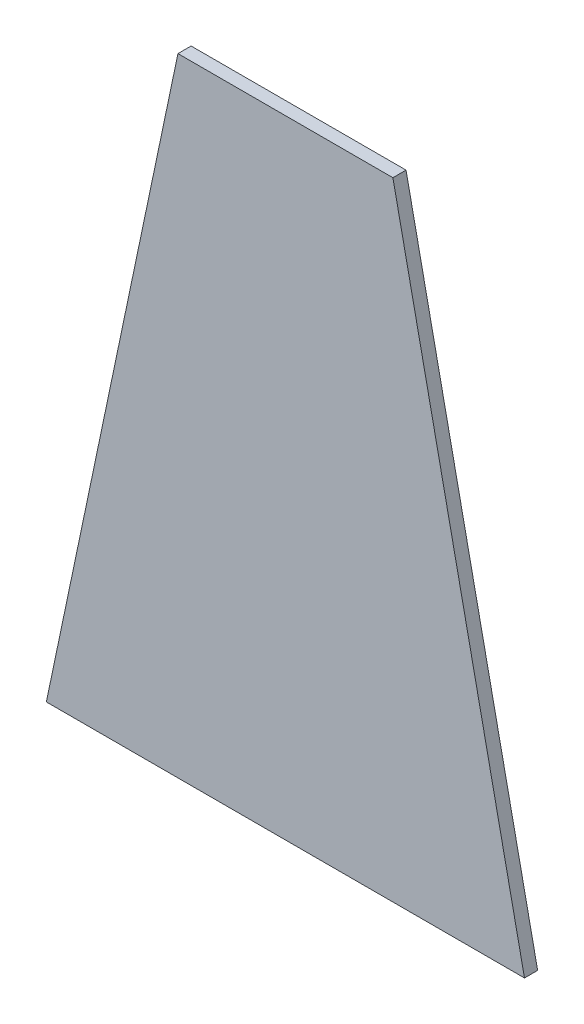
ISO-10303-21;
HEADER;
FILE_DESCRIPTION(('STEP AP214'),'2;1');
FILE_NAME('part.step','',(''),(''),'','','');
FILE_SCHEMA(('AUTOMOTIVE_DESIGN { 1 0 10303 214 1 1 1 1 }'));
ENDSEC;
DATA;
#1=APPLICATION_CONTEXT('core data for automotive mechanical design processes');
#2=APPLICATION_PROTOCOL_DEFINITION('international standard','automotive_design',2000,#1);
#3=PRODUCT_CONTEXT('',#1,'mechanical');
#4=PRODUCT('Part','Part','',(#3));
#5=PRODUCT_RELATED_PRODUCT_CATEGORY('part','',(#4));
#6=PRODUCT_DEFINITION_FORMATION('','',#4);
#7=PRODUCT_DEFINITION_CONTEXT('part definition',#1,'design');
#8=PRODUCT_DEFINITION('design','',#6,#7);
#9=PRODUCT_DEFINITION_SHAPE('','',#8);
#10=(LENGTH_UNIT() NAMED_UNIT(*) SI_UNIT(.MILLI.,.METRE.));
#11=(NAMED_UNIT(*) PLANE_ANGLE_UNIT() SI_UNIT($,.RADIAN.));
#12=(NAMED_UNIT(*) SI_UNIT($,.STERADIAN.) SOLID_ANGLE_UNIT());
#13=UNCERTAINTY_MEASURE_WITH_UNIT(LENGTH_MEASURE(1.E-05),#10,'distance_accuracy_value','');
#14=(GEOMETRIC_REPRESENTATION_CONTEXT(3) GLOBAL_UNCERTAINTY_ASSIGNED_CONTEXT((#13)) GLOBAL_UNIT_ASSIGNED_CONTEXT((#10,
#11,#12)) REPRESENTATION_CONTEXT('',''));
#15=CARTESIAN_POINT('',(0.,0.,0.));
#16=DIRECTION('',(0.,0.,1.));
#17=DIRECTION('',(1.,0.,0.));
#18=AXIS2_PLACEMENT_3D('',#15,#16,#17);
#19=CARTESIAN_POINT('',(0.,0.,3.));
#20=DIRECTION('',(0.97869477300638,-0.20532058174959,0.));
#21=DIRECTION('',(0.20532058174959,0.97869477300638,0.));
#22=AXIS2_PLACEMENT_3D('',#19,#20,#21);
#23=PLANE('',#22);
#24=DIRECTION('',(-0.20532058174959,-0.97869477300638,0.));
#25=VECTOR('',#24,1.);
#26=CARTESIAN_POINT('',(0.,0.,0.));
#27=LINE('',#26,#25);
#28=CARTESIAN_POINT('',(30.,143.,0.));
#29=VERTEX_POINT('',#28);
#30=CARTESIAN_POINT('',(0.,0.,0.));
#31=VERTEX_POINT('',#30);
#32=EDGE_CURVE('E100',#29,#31,#27,.T.);
#33=ORIENTED_EDGE('',*,*,#32,.T.);
#34=DIRECTION('',(0.,0.,-1.));
#35=VECTOR('',#34,1.);
#36=CARTESIAN_POINT('',(0.,0.,3.));
#37=LINE('',#36,#35);
#38=CARTESIAN_POINT('',(0.,0.,3.));
#39=VERTEX_POINT('',#38);
#40=EDGE_CURVE('E11',#39,#31,#37,.T.);
#41=ORIENTED_EDGE('',*,*,#40,.F.);
#42=DIRECTION('',(-0.20532058174959,-0.97869477300638,0.));
#43=VECTOR('',#42,1.);
#44=CARTESIAN_POINT('',(0.,0.,3.));
#45=LINE('',#44,#43);
#46=CARTESIAN_POINT('',(30.,143.,3.));
#47=VERTEX_POINT('',#46);
#48=EDGE_CURVE('E88',#47,#39,#45,.T.);
#49=ORIENTED_EDGE('',*,*,#48,.F.);
#50=DIRECTION('',(0.,0.,-1.));
#51=VECTOR('',#50,1.);
#52=CARTESIAN_POINT('',(30.,143.,3.));
#53=LINE('',#52,#51);
#54=EDGE_CURVE('E96',#47,#29,#53,.T.);
#55=ORIENTED_EDGE('',*,*,#54,.T.);
#56=EDGE_LOOP('',(#33,#41,#49,#55));
#57=FACE_BOUND('',#56,.T.);
#58=ADVANCED_FACE('F37',(#57),#23,.F.);
#59=CARTESIAN_POINT('',(0.,0.,3.));
#60=DIRECTION('',(0.,1.,0.));
#61=DIRECTION('',(0.,0.,1.));
#62=AXIS2_PLACEMENT_3D('',#59,#60,#61);
#63=PLANE('',#62);
#64=DIRECTION('',(1.,0.,0.));
#65=VECTOR('',#64,1.);
#66=CARTESIAN_POINT('',(0.,0.,0.));
#67=LINE('',#66,#65);
#68=CARTESIAN_POINT('',(109.,0.,0.));
#69=VERTEX_POINT('',#68);
#70=EDGE_CURVE('E92',#31,#69,#67,.T.);
#71=ORIENTED_EDGE('',*,*,#70,.T.);
#72=DIRECTION('',(0.,0.,-1.));
#73=VECTOR('',#72,1.);
#74=CARTESIAN_POINT('',(109.,0.,3.));
#75=LINE('',#74,#73);
#76=CARTESIAN_POINT('',(109.,0.,3.));
#77=VERTEX_POINT('',#76);
#78=EDGE_CURVE('E45',#77,#69,#75,.T.);
#79=ORIENTED_EDGE('',*,*,#78,.F.);
#80=DIRECTION('',(1.,0.,0.));
#81=VECTOR('',#80,1.);
#82=CARTESIAN_POINT('',(0.,0.,3.));
#83=LINE('',#82,#81);
#84=EDGE_CURVE('E83',#39,#77,#83,.T.);
#85=ORIENTED_EDGE('',*,*,#84,.F.);
#86=ORIENTED_EDGE('',*,*,#40,.T.);
#87=EDGE_LOOP('',(#71,#79,#85,#86));
#88=FACE_BOUND('',#87,.T.);
#89=ADVANCED_FACE('F91',(#88),#63,.F.);
#90=CARTESIAN_POINT('',(109.,0.,3.));
#91=DIRECTION('',(-0.97869477300638,-0.20532058174959,0.));
#92=DIRECTION('',(0.20532058174959,-0.97869477300638,0.));
#93=AXIS2_PLACEMENT_3D('',#90,#91,#92);
#94=PLANE('',#93);
#95=DIRECTION('',(-0.20532058174959,0.97869477300638,0.));
#96=VECTOR('',#95,1.);
#97=CARTESIAN_POINT('',(109.,0.,0.));
#98=LINE('',#97,#96);
#99=CARTESIAN_POINT('',(79.,143.,0.));
#100=VERTEX_POINT('',#99);
#101=EDGE_CURVE('E70',#69,#100,#98,.T.);
#102=ORIENTED_EDGE('',*,*,#101,.T.);
#103=DIRECTION('',(0.,0.,-1.));
#104=VECTOR('',#103,1.);
#105=CARTESIAN_POINT('',(79.,143.,3.));
#106=LINE('',#105,#104);
#107=CARTESIAN_POINT('',(79.,143.,3.));
#108=VERTEX_POINT('',#107);
#109=EDGE_CURVE('E93',#108,#100,#106,.T.);
#110=ORIENTED_EDGE('',*,*,#109,.F.);
#111=DIRECTION('',(-0.20532058174959,0.97869477300638,0.));
#112=VECTOR('',#111,1.);
#113=CARTESIAN_POINT('',(109.,0.,3.));
#114=LINE('',#113,#112);
#115=EDGE_CURVE('E86',#77,#108,#114,.T.);
#116=ORIENTED_EDGE('',*,*,#115,.F.);
#117=ORIENTED_EDGE('',*,*,#78,.T.);
#118=EDGE_LOOP('',(#102,#110,#116,#117));
#119=FACE_BOUND('',#118,.T.);
#120=ADVANCED_FACE('F94',(#119),#94,.F.);
#121=CARTESIAN_POINT('',(30.,143.,3.));
#122=DIRECTION('',(0.,-1.,0.));
#123=DIRECTION('',(0.,0.,-1.));
#124=AXIS2_PLACEMENT_3D('',#121,#122,#123);
#125=PLANE('',#124);
#126=DIRECTION('',(-1.,0.,0.));
#127=VECTOR('',#126,1.);
#128=CARTESIAN_POINT('',(30.,143.,0.));
#129=LINE('',#128,#127);
#130=EDGE_CURVE('E76',#100,#29,#129,.T.);
#131=ORIENTED_EDGE('',*,*,#130,.T.);
#132=ORIENTED_EDGE('',*,*,#54,.F.);
#133=DIRECTION('',(-1.,0.,0.));
#134=VECTOR('',#133,1.);
#135=CARTESIAN_POINT('',(30.,143.,3.));
#136=LINE('',#135,#134);
#137=EDGE_CURVE('E53',#108,#47,#136,.T.);
#138=ORIENTED_EDGE('',*,*,#137,.F.);
#139=ORIENTED_EDGE('',*,*,#109,.T.);
#140=EDGE_LOOP('',(#131,#132,#138,#139));
#141=FACE_BOUND('',#140,.T.);
#142=ADVANCED_FACE('F107',(#141),#125,.F.);
#143=CARTESIAN_POINT('',(0.,0.,3.));
#144=DIRECTION('',(0.,0.,-1.));
#145=DIRECTION('',(-1.,0.,0.));
#146=AXIS2_PLACEMENT_3D('',#143,#144,#145);
#147=PLANE('',#146);
#148=ORIENTED_EDGE('',*,*,#48,.T.);
#149=ORIENTED_EDGE('',*,*,#84,.T.);
#150=ORIENTED_EDGE('',*,*,#115,.T.);
#151=ORIENTED_EDGE('',*,*,#137,.T.);
#152=EDGE_LOOP('',(#148,#149,#150,#151));
#153=FACE_BOUND('',#152,.T.);
#154=ADVANCED_FACE('F84',(#153),#147,.F.);
#155=CARTESIAN_POINT('',(0.,0.,0.));
#156=DIRECTION('',(0.,0.,-1.));
#157=DIRECTION('',(-1.,0.,0.));
#158=AXIS2_PLACEMENT_3D('',#155,#156,#157);
#159=PLANE('',#158);
#160=ORIENTED_EDGE('',*,*,#32,.F.);
#161=ORIENTED_EDGE('',*,*,#130,.F.);
#162=ORIENTED_EDGE('',*,*,#101,.F.);
#163=ORIENTED_EDGE('',*,*,#70,.F.);
#164=EDGE_LOOP('',(#160,#161,#162,#163));
#165=FACE_BOUND('',#164,.T.);
#166=ADVANCED_FACE('F110',(#165),#159,.T.);
#167=CLOSED_SHELL('',(#58,#89,#120,#142,#154,#166));
#168=MANIFOLD_SOLID_BREP('B2',#167);
#169=ADVANCED_BREP_SHAPE_REPRESENTATION('',(#18,#168),#14);
#170=SHAPE_DEFINITION_REPRESENTATION(#9,#169);
ENDSEC;
END-ISO-10303-21;
